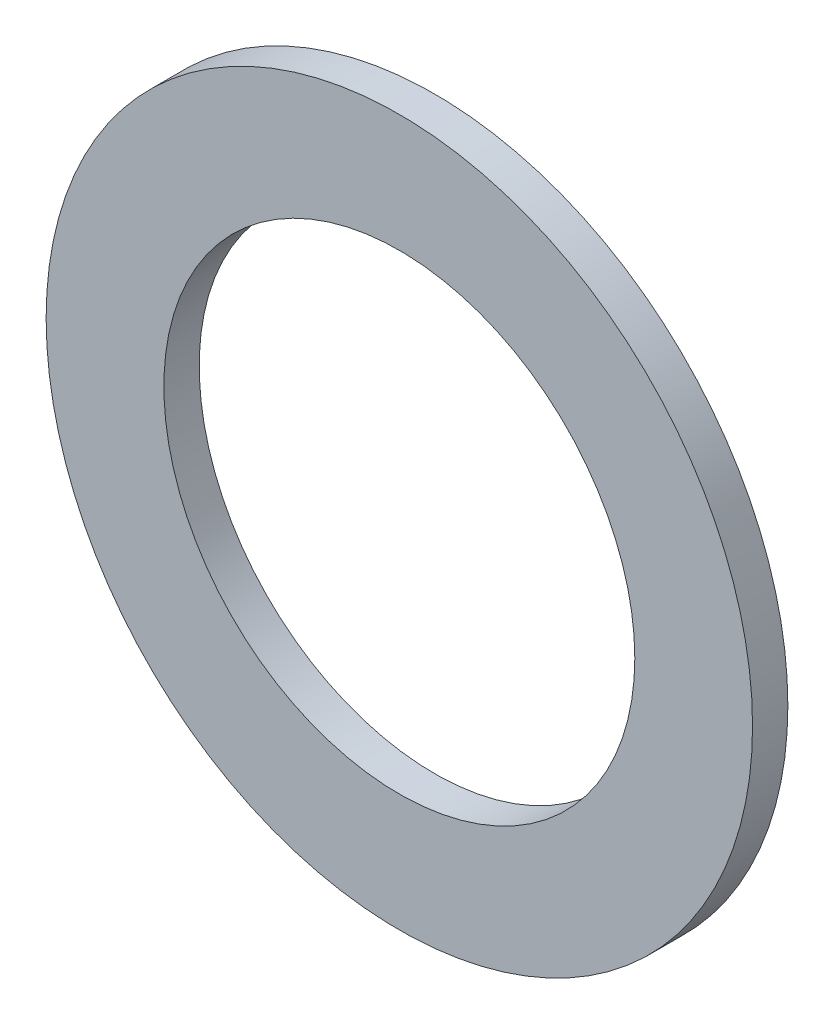
ISO-10303-21;
HEADER;
FILE_DESCRIPTION(('STEP AP214'),'2;1');
FILE_NAME('part.step','',(''),(''),'','','');
FILE_SCHEMA(('AUTOMOTIVE_DESIGN { 1 0 10303 214 1 1 1 1 }'));
ENDSEC;
DATA;
#1=APPLICATION_CONTEXT('core data for automotive mechanical design processes');
#2=APPLICATION_PROTOCOL_DEFINITION('international standard','automotive_design',2000,#1);
#3=PRODUCT_CONTEXT('',#1,'mechanical');
#4=PRODUCT('Part','Part','',(#3));
#5=PRODUCT_RELATED_PRODUCT_CATEGORY('part','',(#4));
#6=PRODUCT_DEFINITION_FORMATION('','',#4);
#7=PRODUCT_DEFINITION_CONTEXT('part definition',#1,'design');
#8=PRODUCT_DEFINITION('design','',#6,#7);
#9=PRODUCT_DEFINITION_SHAPE('','',#8);
#10=(LENGTH_UNIT() NAMED_UNIT(*) SI_UNIT(.MILLI.,.METRE.));
#11=(NAMED_UNIT(*) PLANE_ANGLE_UNIT() SI_UNIT($,.RADIAN.));
#12=(NAMED_UNIT(*) SI_UNIT($,.STERADIAN.) SOLID_ANGLE_UNIT());
#13=UNCERTAINTY_MEASURE_WITH_UNIT(LENGTH_MEASURE(1.E-05),#10,'distance_accuracy_value','');
#14=(GEOMETRIC_REPRESENTATION_CONTEXT(3) GLOBAL_UNCERTAINTY_ASSIGNED_CONTEXT((#13)) GLOBAL_UNIT_ASSIGNED_CONTEXT((#10,
#11,#12)) REPRESENTATION_CONTEXT('',''));
#15=CARTESIAN_POINT('',(0.,0.,0.));
#16=DIRECTION('',(0.,0.,1.));
#17=DIRECTION('',(1.,0.,0.));
#18=AXIS2_PLACEMENT_3D('',#15,#16,#17);
#19=CARTESIAN_POINT('',(0.,0.,3.));
#20=DIRECTION('',(0.,0.,1.));
#21=DIRECTION('',(1.,0.,0.));
#22=AXIS2_PLACEMENT_3D('',#19,#20,#21);
#23=PLANE('',#22);
#24=CARTESIAN_POINT('',(0.,0.,3.));
#25=DIRECTION('',(0.,0.,1.));
#26=DIRECTION('',(1.,0.,0.));
#27=AXIS2_PLACEMENT_3D('',#24,#25,#26);
#28=CIRCLE('',#27,30.);
#29=CARTESIAN_POINT('',(30.,0.,3.));
#30=VERTEX_POINT('',#29);
#31=EDGE_CURVE('E10',#30,#30,#28,.T.);
#32=ORIENTED_EDGE('',*,*,#31,.T.);
#33=EDGE_LOOP('',(#32));
#34=FACE_BOUND('',#33,.T.);
#35=CARTESIAN_POINT('',(0.,0.,3.));
#36=DIRECTION('',(0.,0.,1.));
#37=DIRECTION('',(1.,0.,0.));
#38=AXIS2_PLACEMENT_3D('',#35,#36,#37);
#39=CIRCLE('',#38,20.);
#40=CARTESIAN_POINT('',(20.,0.,3.));
#41=VERTEX_POINT('',#40);
#42=EDGE_CURVE('E50',#41,#41,#39,.T.);
#43=ORIENTED_EDGE('',*,*,#42,.F.);
#44=EDGE_LOOP('',(#43));
#45=FACE_BOUND('',#44,.T.);
#46=ADVANCED_FACE('F37',(#34,#45),#23,.T.);
#47=CARTESIAN_POINT('',(0.,0.,0.));
#48=DIRECTION('',(0.,0.,1.));
#49=DIRECTION('',(1.,0.,0.));
#50=AXIS2_PLACEMENT_3D('',#47,#48,#49);
#51=PLANE('',#50);
#52=CARTESIAN_POINT('',(0.,0.,0.));
#53=DIRECTION('',(0.,0.,1.));
#54=DIRECTION('',(1.,0.,0.));
#55=AXIS2_PLACEMENT_3D('',#52,#53,#54);
#56=CIRCLE('',#55,30.);
#57=CARTESIAN_POINT('',(30.,0.,0.));
#58=VERTEX_POINT('',#57);
#59=EDGE_CURVE('E41',#58,#58,#56,.T.);
#60=ORIENTED_EDGE('',*,*,#59,.F.);
#61=EDGE_LOOP('',(#60));
#62=FACE_BOUND('',#61,.T.);
#63=CARTESIAN_POINT('',(0.,0.,0.));
#64=DIRECTION('',(0.,0.,1.));
#65=DIRECTION('',(1.,0.,0.));
#66=AXIS2_PLACEMENT_3D('',#63,#64,#65);
#67=CIRCLE('',#66,20.);
#68=CARTESIAN_POINT('',(20.,0.,0.));
#69=VERTEX_POINT('',#68);
#70=EDGE_CURVE('E52',#69,#69,#67,.T.);
#71=ORIENTED_EDGE('',*,*,#70,.T.);
#72=EDGE_LOOP('',(#71));
#73=FACE_BOUND('',#72,.T.);
#74=ADVANCED_FACE('F64',(#62,#73),#51,.F.);
#75=CARTESIAN_POINT('',(0.,0.,3.));
#76=DIRECTION('',(0.,0.,-1.));
#77=DIRECTION('',(-1.,0.,0.));
#78=AXIS2_PLACEMENT_3D('',#75,#76,#77);
#79=CYLINDRICAL_SURFACE('',#78,30.);
#80=ORIENTED_EDGE('',*,*,#31,.F.);
#81=EDGE_LOOP('',(#80));
#82=FACE_BOUND('',#81,.T.);
#83=ORIENTED_EDGE('',*,*,#59,.T.);
#84=EDGE_LOOP('',(#83));
#85=FACE_BOUND('',#84,.T.);
#86=ADVANCED_FACE('F39',(#82,#85),#79,.T.);
#87=CARTESIAN_POINT('',(0.,0.,3.));
#88=DIRECTION('',(0.,0.,-1.));
#89=DIRECTION('',(-1.,0.,0.));
#90=AXIS2_PLACEMENT_3D('',#87,#88,#89);
#91=CYLINDRICAL_SURFACE('',#90,20.);
#92=ORIENTED_EDGE('',*,*,#42,.T.);
#93=EDGE_LOOP('',(#92));
#94=FACE_BOUND('',#93,.T.);
#95=ORIENTED_EDGE('',*,*,#70,.F.);
#96=EDGE_LOOP('',(#95));
#97=FACE_BOUND('',#96,.T.);
#98=ADVANCED_FACE('F60',(#94,#97),#91,.F.);
#99=CLOSED_SHELL('',(#46,#74,#86,#98));
#100=MANIFOLD_SOLID_BREP('B2',#99);
#101=ADVANCED_BREP_SHAPE_REPRESENTATION('',(#18,#100),#14);
#102=SHAPE_DEFINITION_REPRESENTATION(#9,#101);
ENDSEC;
END-ISO-10303-21;
